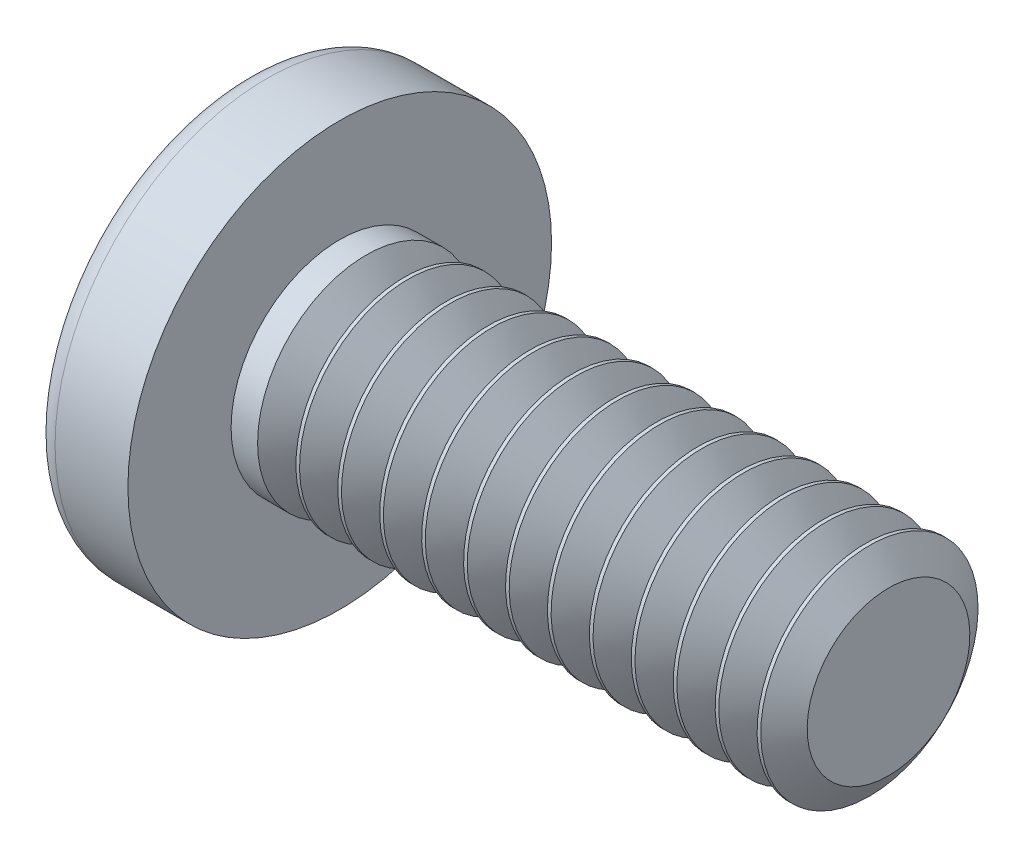
ISO-10303-21;
HEADER;
FILE_DESCRIPTION(('STEP AP214'),'2;1');
FILE_NAME('part.step','',(''),(''),'','','');
FILE_SCHEMA(('AUTOMOTIVE_DESIGN { 1 0 10303 214 1 1 1 1 }'));
ENDSEC;
DATA;
#1=APPLICATION_CONTEXT('core data for automotive mechanical design processes');
#2=APPLICATION_PROTOCOL_DEFINITION('international standard','automotive_design',2000,#1);
#3=PRODUCT_CONTEXT('',#1,'mechanical');
#4=PRODUCT('Part','Part','',(#3));
#5=PRODUCT_RELATED_PRODUCT_CATEGORY('part','',(#4));
#6=PRODUCT_DEFINITION_FORMATION('','',#4);
#7=PRODUCT_DEFINITION_CONTEXT('part definition',#1,'design');
#8=PRODUCT_DEFINITION('design','',#6,#7);
#9=PRODUCT_DEFINITION_SHAPE('','',#8);
#10=(LENGTH_UNIT() NAMED_UNIT(*) SI_UNIT(.MILLI.,.METRE.));
#11=(NAMED_UNIT(*) PLANE_ANGLE_UNIT() SI_UNIT($,.RADIAN.));
#12=(NAMED_UNIT(*) SI_UNIT($,.STERADIAN.) SOLID_ANGLE_UNIT());
#13=UNCERTAINTY_MEASURE_WITH_UNIT(LENGTH_MEASURE(1.E-05),#10,'distance_accuracy_value','');
#14=(GEOMETRIC_REPRESENTATION_CONTEXT(3) GLOBAL_UNCERTAINTY_ASSIGNED_CONTEXT((#13)) GLOBAL_UNIT_ASSIGNED_CONTEXT((#10,
#11,#12)) REPRESENTATION_CONTEXT('',''));
#15=CARTESIAN_POINT('',(0.,0.,0.));
#16=DIRECTION('',(0.,0.,1.));
#17=DIRECTION('',(1.,0.,0.));
#18=AXIS2_PLACEMENT_3D('',#15,#16,#17);
#19=CARTESIAN_POINT('',(4.02336,0.,0.));
#20=DIRECTION('',(-1.,0.,0.));
#21=DIRECTION('',(0.,1.,0.));
#22=AXIS2_PLACEMENT_3D('',#19,#20,#21);
#23=SPHERICAL_SURFACE('',#22,4.02336);
#24=CARTESIAN_POINT('',(0.754157473864415,0.,0.));
#25=DIRECTION('',(-1.,0.,0.));
#26=DIRECTION('',(0.,0.,1.));
#27=AXIS2_PLACEMENT_3D('',#24,#25,#26);
#28=CIRCLE('',#27,2.3451525606469);
#29=CARTESIAN_POINT('',(0.754157473864415,0.,2.3451525606469));
#30=VERTEX_POINT('',#29);
#31=EDGE_CURVE('E154',#30,#30,#28,.T.);
#32=ORIENTED_EDGE('',*,*,#31,.T.);
#33=EDGE_LOOP('',(#32));
#34=FACE_BOUND('',#33,.T.);
#35=CARTESIAN_POINT('',(4.01770186530247,-0.0538498336730852,0.));
#36=DIRECTION('',(-0.104497210902911,-0.994525179627702,0.));
#37=DIRECTION('',(0.994525179627702,-0.104497210902911,0.));
#38=AXIS2_PLACEMENT_3D('',#35,#36,#37);
#39=CIRCLE('',#38,4.02299563391823);
#40=CARTESIAN_POINT('',(0.259410845244607,0.341043063361975,1.37978334493095));
#41=VERTEX_POINT('',#40);
#42=CARTESIAN_POINT('',(0.0332155077767127,0.36480996476259,0.364809964762592));
#43=VERTEX_POINT('',#42);
#44=EDGE_CURVE('E185',#41,#43,#39,.T.);
#45=ORIENTED_EDGE('',*,*,#44,.F.);
#46=CARTESIAN_POINT('',(3.2260782242415,0.,-0.995700317236856));
#47=DIRECTION('',(0.625039893301157,0.,0.780592807923618));
#48=DIRECTION('',(0.780592807923618,0.,-0.625039893301158));
#49=AXIS2_PLACEMENT_3D('',#46,#47,#48);
#50=CIRCLE('',#49,3.81580245006182);
#51=CARTESIAN_POINT('',(0.259410845244607,-0.341043063361985,1.37978334493095));
#52=VERTEX_POINT('',#51);
#53=EDGE_CURVE('E153',#41,#52,#50,.T.);
#54=ORIENTED_EDGE('',*,*,#53,.T.);
#55=CARTESIAN_POINT('',(4.01770186530247,0.0538498336730849,0.));
#56=DIRECTION('',(-0.104497210902911,0.994525179627702,0.));
#57=DIRECTION('',(-0.994525179627702,-0.104497210902911,0.));
#58=AXIS2_PLACEMENT_3D('',#55,#56,#57);
#59=CIRCLE('',#58,4.02299563391823);
#60=CARTESIAN_POINT('',(0.0332155077767127,-0.364809964762593,0.364809964762591));
#61=VERTEX_POINT('',#60);
#62=EDGE_CURVE('E109',#61,#52,#59,.T.);
#63=ORIENTED_EDGE('',*,*,#62,.F.);
#64=CARTESIAN_POINT('',(4.01770186530247,0.,-0.0538498336730849));
#65=DIRECTION('',(-0.104497210902911,0.,-0.994525179627702));
#66=DIRECTION('',(-0.994525179627702,0.,0.104497210902911));
#67=AXIS2_PLACEMENT_3D('',#64,#65,#66);
#68=CIRCLE('',#67,4.02299563391823);
#69=CARTESIAN_POINT('',(0.259410845244607,-1.37978334493095,0.341043063361979));
#70=VERTEX_POINT('',#69);
#71=EDGE_CURVE('E134',#70,#61,#68,.T.);
#72=ORIENTED_EDGE('',*,*,#71,.F.);
#73=CARTESIAN_POINT('',(3.2260782242415,0.995700317236855,0.));
#74=DIRECTION('',(0.625039893301157,-0.780592807923618,0.));
#75=DIRECTION('',(0.780592807923618,0.625039893301158,0.));
#76=AXIS2_PLACEMENT_3D('',#73,#74,#75);
#77=CIRCLE('',#76,3.81580245006182);
#78=CARTESIAN_POINT('',(0.259410845244607,-1.37978334493095,-0.34104306336198));
#79=VERTEX_POINT('',#78);
#80=EDGE_CURVE('E142',#70,#79,#77,.T.);
#81=ORIENTED_EDGE('',*,*,#80,.T.);
#82=CARTESIAN_POINT('',(4.01770186530247,0.,0.0538498336730852));
#83=DIRECTION('',(-0.104497210902911,0.,0.994525179627702));
#84=DIRECTION('',(0.994525179627702,0.,0.104497210902911));
#85=AXIS2_PLACEMENT_3D('',#82,#83,#84);
#86=CIRCLE('',#85,4.02299563391823);
#87=CARTESIAN_POINT('',(0.0332155077767127,-0.36480996476259,-0.364809964762592));
#88=VERTEX_POINT('',#87);
#89=EDGE_CURVE('E52',#88,#79,#86,.T.);
#90=ORIENTED_EDGE('',*,*,#89,.F.);
#91=CARTESIAN_POINT('',(0.259410845244607,-0.341043063361975,-1.37978334493095));
#92=VERTEX_POINT('',#91);
#93=EDGE_CURVE('E192',#92,#88,#59,.T.);
#94=ORIENTED_EDGE('',*,*,#93,.F.);
#95=CARTESIAN_POINT('',(3.2260782242415,0.,0.995700317236856));
#96=DIRECTION('',(0.625039893301157,0.,-0.780592807923618));
#97=DIRECTION('',(-0.780592807923618,0.,-0.625039893301158));
#98=AXIS2_PLACEMENT_3D('',#95,#96,#97);
#99=CIRCLE('',#98,3.81580245006182);
#100=CARTESIAN_POINT('',(0.259410845244607,0.341043063361985,-1.37978334493095));
#101=VERTEX_POINT('',#100);
#102=EDGE_CURVE('E135',#92,#101,#99,.T.);
#103=ORIENTED_EDGE('',*,*,#102,.T.);
#104=CARTESIAN_POINT('',(0.0332155077767127,0.364809964762593,-0.364809964762592));
#105=VERTEX_POINT('',#104);
#106=EDGE_CURVE('E180',#105,#101,#39,.T.);
#107=ORIENTED_EDGE('',*,*,#106,.F.);
#108=CARTESIAN_POINT('',(0.259410845244607,1.37978334493095,-0.34104306336198));
#109=VERTEX_POINT('',#108);
#110=EDGE_CURVE('E45',#109,#105,#86,.T.);
#111=ORIENTED_EDGE('',*,*,#110,.F.);
#112=CARTESIAN_POINT('',(3.2260782242415,-0.995700317236856,0.));
#113=DIRECTION('',(0.625039893301157,0.780592807923618,0.));
#114=DIRECTION('',(-0.780592807923618,0.625039893301158,0.));
#115=AXIS2_PLACEMENT_3D('',#112,#113,#114);
#116=CIRCLE('',#115,3.81580245006182);
#117=CARTESIAN_POINT('',(0.259410845244607,1.37978334493095,0.34104306336198));
#118=VERTEX_POINT('',#117);
#119=EDGE_CURVE('E11',#109,#118,#116,.T.);
#120=ORIENTED_EDGE('',*,*,#119,.T.);
#121=EDGE_CURVE('E168',#43,#118,#68,.T.);
#122=ORIENTED_EDGE('',*,*,#121,.F.);
#123=EDGE_LOOP('',(#45,#54,#63,#72,#81,#90,#94,#103,#107,#111,#120,#122));
#124=FACE_BOUND('',#123,.T.);
#125=ADVANCED_FACE('F37',(#34,#124),#23,.T.);
#126=CARTESIAN_POINT('',(1.98257918552036,0.,-0.159985520361991));
#127=DIRECTION('',(-0.104497210902911,0.,0.994525179627702));
#128=DIRECTION('',(0.994525179627702,0.,0.104497210902911));
#129=AXIS2_PLACEMENT_3D('',#126,#127,#128);
#130=PLANE('',#129);
#131=ORIENTED_EDGE('',*,*,#110,.T.);
#132=DIRECTION('',(0.989139306726397,-0.103931303967629,0.103931303967629));
#133=VECTOR('',#132,1.);
#134=CARTESIAN_POINT('',(1.99902610304942,0.158257402215822,-0.158257402215822));
#135=LINE('',#134,#133);
#136=CARTESIAN_POINT('',(1.7526,0.184150000000001,-0.184149999999999));
#137=VERTEX_POINT('',#136);
#138=EDGE_CURVE('E174',#105,#137,#135,.T.);
#139=ORIENTED_EDGE('',*,*,#138,.T.);
#140=DIRECTION('',(0.777980423727664,-0.622948092912368,0.0817443198844285));
#141=VECTOR('',#140,1.);
#142=CARTESIAN_POINT('',(0.,1.5875,-0.3683));
#143=LINE('',#142,#141);
#144=EDGE_CURVE('E158',#109,#137,#143,.T.);
#145=ORIENTED_EDGE('',*,*,#144,.F.);
#146=EDGE_LOOP('',(#131,#139,#145));
#147=FACE_BOUND('',#146,.T.);
#148=ADVANCED_FACE('F173',(#147),#130,.T.);
#149=DIRECTION('',(0.777980423727664,0.622948092912368,0.0817443198844285));
#150=VECTOR('',#149,1.);
#151=CARTESIAN_POINT('',(0.,-1.5875,-0.3683));
#152=LINE('',#151,#150);
#153=CARTESIAN_POINT('',(1.7526,-0.18415,-0.18415));
#154=VERTEX_POINT('',#153);
#155=EDGE_CURVE('E143',#79,#154,#152,.T.);
#156=ORIENTED_EDGE('',*,*,#155,.T.);
#157=DIRECTION('',(-0.989139306726397,-0.103931303967628,-0.103931303967629));
#158=VECTOR('',#157,1.);
#159=CARTESIAN_POINT('',(1.99902610304942,-0.158257402215821,-0.158257402215822));
#160=LINE('',#159,#158);
#161=EDGE_CURVE('E195',#154,#88,#160,.T.);
#162=ORIENTED_EDGE('',*,*,#161,.T.);
#163=ORIENTED_EDGE('',*,*,#89,.T.);
#164=EDGE_LOOP('',(#156,#162,#163));
#165=FACE_BOUND('',#164,.T.);
#166=ADVANCED_FACE('F337',(#165),#130,.T.);
#167=CARTESIAN_POINT('',(1.98257918552036,0.,0.159985520361991));
#168=DIRECTION('',(-0.104497210902911,0.,-0.994525179627702));
#169=DIRECTION('',(-0.994525179627702,0.,0.104497210902911));
#170=AXIS2_PLACEMENT_3D('',#167,#168,#169);
#171=PLANE('',#170);
#172=DIRECTION('',(0.777980423727664,-0.622948092912368,-0.0817443198844284));
#173=VECTOR('',#172,1.);
#174=CARTESIAN_POINT('',(0.,1.5875,0.3683));
#175=LINE('',#174,#173);
#176=CARTESIAN_POINT('',(1.7526,0.18415,0.18415));
#177=VERTEX_POINT('',#176);
#178=EDGE_CURVE('E982',#118,#177,#175,.T.);
#179=ORIENTED_EDGE('',*,*,#178,.T.);
#180=DIRECTION('',(-0.989139306726397,0.103931303967628,0.103931303967629));
#181=VECTOR('',#180,1.);
#182=CARTESIAN_POINT('',(1.99902610304942,0.158257402215821,0.158257402215822));
#183=LINE('',#182,#181);
#184=EDGE_CURVE('E189',#177,#43,#183,.T.);
#185=ORIENTED_EDGE('',*,*,#184,.T.);
#186=ORIENTED_EDGE('',*,*,#121,.T.);
#187=EDGE_LOOP('',(#179,#185,#186));
#188=FACE_BOUND('',#187,.T.);
#189=ADVANCED_FACE('F367',(#188),#171,.T.);
#190=ORIENTED_EDGE('',*,*,#71,.T.);
#191=DIRECTION('',(0.989139306726397,0.103931303967629,-0.103931303967629));
#192=VECTOR('',#191,1.);
#193=CARTESIAN_POINT('',(1.99902610304942,-0.158257402215822,0.158257402215822));
#194=LINE('',#193,#192);
#195=CARTESIAN_POINT('',(1.7526,-0.184150000000001,0.18415));
#196=VERTEX_POINT('',#195);
#197=EDGE_CURVE('E107',#61,#196,#194,.T.);
#198=ORIENTED_EDGE('',*,*,#197,.T.);
#199=DIRECTION('',(0.777980423727664,0.622948092912368,-0.0817443198844283));
#200=VECTOR('',#199,1.);
#201=CARTESIAN_POINT('',(0.,-1.5875,0.3683));
#202=LINE('',#201,#200);
#203=EDGE_CURVE('E132',#70,#196,#202,.T.);
#204=ORIENTED_EDGE('',*,*,#203,.F.);
#205=EDGE_LOOP('',(#190,#198,#204));
#206=FACE_BOUND('',#205,.T.);
#207=ADVANCED_FACE('F131',(#206),#171,.T.);
#208=CARTESIAN_POINT('',(-25.4,0.,0.));
#209=DIRECTION('',(-1.,0.,0.));
#210=DIRECTION('',(0.,0.,1.));
#211=AXIS2_PLACEMENT_3D('',#208,#209,#210);
#212=CYLINDRICAL_SURFACE('',#211,1.2573);
#213=CARTESIAN_POINT('',(2.11029337019194,0.,0.));
#214=DIRECTION('',(-1.,0.,0.));
#215=DIRECTION('',(0.,-1.,0.));
#216=AXIS2_PLACEMENT_3D('',#213,#214,#215);
#217=CIRCLE('',#216,1.2573);
#218=CARTESIAN_POINT('',(2.11029337019194,-1.2573,0.));
#219=VERTEX_POINT('',#218);
#220=EDGE_CURVE('E207',#219,#219,#217,.T.);
#221=ORIENTED_EDGE('',*,*,#220,.T.);
#222=EDGE_LOOP('',(#221));
#223=FACE_BOUND('',#222,.T.);
#224=CARTESIAN_POINT('',(1.8034,0.,0.));
#225=DIRECTION('',(-1.,0.,0.));
#226=DIRECTION('',(0.,0.,1.));
#227=AXIS2_PLACEMENT_3D('',#224,#225,#226);
#228=CIRCLE('',#227,1.2573);
#229=CARTESIAN_POINT('',(1.8034,0.,1.2573));
#230=VERTEX_POINT('',#229);
#231=EDGE_CURVE('E164',#230,#230,#228,.T.);
#232=ORIENTED_EDGE('',*,*,#231,.F.);
#233=EDGE_LOOP('',(#232));
#234=FACE_BOUND('',#233,.T.);
#235=ADVANCED_FACE('F39',(#223,#234),#212,.T.);
#236=CARTESIAN_POINT('',(1.8034,1.2573,0.));
#237=DIRECTION('',(-1.,0.,0.));
#238=DIRECTION('',(0.,0.,1.));
#239=AXIS2_PLACEMENT_3D('',#236,#237,#238);
#240=PLANE('',#239);
#241=CARTESIAN_POINT('',(1.8034,0.,0.));
#242=DIRECTION('',(-1.,0.,0.));
#243=DIRECTION('',(0.,0.,1.));
#244=AXIS2_PLACEMENT_3D('',#241,#242,#243);
#245=CIRCLE('',#244,2.4511);
#246=CARTESIAN_POINT('',(1.8034,0.,2.4511));
#247=VERTEX_POINT('',#246);
#248=EDGE_CURVE('E161',#247,#247,#245,.T.);
#249=ORIENTED_EDGE('',*,*,#248,.F.);
#250=EDGE_LOOP('',(#249));
#251=FACE_BOUND('',#250,.T.);
#252=ORIENTED_EDGE('',*,*,#231,.T.);
#253=EDGE_LOOP('',(#252));
#254=FACE_BOUND('',#253,.T.);
#255=ADVANCED_FACE('F347',(#251,#254),#240,.F.);
#256=CARTESIAN_POINT('',(-25.4,0.,0.));
#257=DIRECTION('',(-1.,0.,0.));
#258=DIRECTION('',(0.,0.,1.));
#259=AXIS2_PLACEMENT_3D('',#256,#257,#258);
#260=CYLINDRICAL_SURFACE('',#259,2.4511);
#261=ORIENTED_EDGE('',*,*,#248,.T.);
#262=EDGE_LOOP('',(#261));
#263=FACE_BOUND('',#262,.T.);
#264=CARTESIAN_POINT('',(0.96054652223156,0.,0.));
#265=DIRECTION('',(-1.,0.,0.));
#266=DIRECTION('',(0.,0.,1.));
#267=AXIS2_PLACEMENT_3D('',#264,#265,#266);
#268=CIRCLE('',#267,2.4511);
#269=CARTESIAN_POINT('',(0.96054652223156,0.,2.4511));
#270=VERTEX_POINT('',#269);
#271=EDGE_CURVE('E157',#270,#270,#268,.T.);
#272=ORIENTED_EDGE('',*,*,#271,.F.);
#273=EDGE_LOOP('',(#272));
#274=FACE_BOUND('',#273,.T.);
#275=ADVANCED_FACE('F344',(#263,#274),#260,.T.);
#276=CARTESIAN_POINT('',(0.960546522231561,0.,0.));
#277=DIRECTION('',(-1.,0.,0.));
#278=DIRECTION('',(0.,0.,1.));
#279=AXIS2_PLACEMENT_3D('',#276,#277,#278);
#280=TOROIDAL_SURFACE('',#279,2.1971,0.254);
#281=ORIENTED_EDGE('',*,*,#271,.T.);
#282=EDGE_LOOP('',(#281));
#283=FACE_BOUND('',#282,.T.);
#284=ORIENTED_EDGE('',*,*,#31,.F.);
#285=EDGE_LOOP('',(#284));
#286=FACE_BOUND('',#285,.T.);
#287=ADVANCED_FACE('F340',(#283,#286),#280,.T.);
#288=CARTESIAN_POINT('',(1.7526,0.18415,0.18415));
#289=DIRECTION('',(0.625039893301157,0.780592807923618,0.));
#290=DIRECTION('',(-0.780592807923618,0.625039893301158,0.));
#291=AXIS2_PLACEMENT_3D('',#288,#289,#290);
#292=PLANE('',#291);
#293=ORIENTED_EDGE('',*,*,#144,.T.);
#294=DIRECTION('',(0.,0.,-1.));
#295=VECTOR('',#294,1.);
#296=CARTESIAN_POINT('',(1.7526,0.18415,0.18415));
#297=LINE('',#296,#295);
#298=EDGE_CURVE('E125',#177,#137,#297,.T.);
#299=ORIENTED_EDGE('',*,*,#298,.F.);
#300=ORIENTED_EDGE('',*,*,#178,.F.);
#301=ORIENTED_EDGE('',*,*,#119,.F.);
#302=EDGE_LOOP('',(#293,#299,#300,#301));
#303=FACE_BOUND('',#302,.T.);
#304=ADVANCED_FACE('F343',(#303),#292,.F.);
#305=CARTESIAN_POINT('',(1.7526,-0.18415,-0.18415));
#306=DIRECTION('',(0.625039893301157,-0.780592807923618,0.));
#307=DIRECTION('',(0.780592807923618,0.625039893301158,0.));
#308=AXIS2_PLACEMENT_3D('',#305,#306,#307);
#309=PLANE('',#308);
#310=ORIENTED_EDGE('',*,*,#203,.T.);
#311=DIRECTION('',(0.,0.,1.));
#312=VECTOR('',#311,1.);
#313=CARTESIAN_POINT('',(1.7526,-0.18415,-0.18415));
#314=LINE('',#313,#312);
#315=EDGE_CURVE('E124',#154,#196,#314,.T.);
#316=ORIENTED_EDGE('',*,*,#315,.F.);
#317=ORIENTED_EDGE('',*,*,#155,.F.);
#318=ORIENTED_EDGE('',*,*,#80,.F.);
#319=EDGE_LOOP('',(#310,#316,#317,#318));
#320=FACE_BOUND('',#319,.T.);
#321=ADVANCED_FACE('F139',(#320),#309,.F.);
#322=CARTESIAN_POINT('',(1.7526,0.18415,-0.18415));
#323=DIRECTION('',(-1.,0.,0.));
#324=DIRECTION('',(0.,0.,1.));
#325=AXIS2_PLACEMENT_3D('',#322,#323,#324);
#326=PLANE('',#325);
#327=DIRECTION('',(0.,1.,0.));
#328=VECTOR('',#327,1.);
#329=CARTESIAN_POINT('',(1.7526,-0.18415,-0.18415));
#330=LINE('',#329,#328);
#331=EDGE_CURVE('E147',#154,#137,#330,.T.);
#332=ORIENTED_EDGE('',*,*,#331,.F.);
#333=ORIENTED_EDGE('',*,*,#315,.T.);
#334=DIRECTION('',(0.,-1.,0.));
#335=VECTOR('',#334,1.);
#336=CARTESIAN_POINT('',(1.7526,0.18415,0.18415));
#337=LINE('',#336,#335);
#338=EDGE_CURVE('E116',#177,#196,#337,.T.);
#339=ORIENTED_EDGE('',*,*,#338,.F.);
#340=ORIENTED_EDGE('',*,*,#298,.T.);
#341=EDGE_LOOP('',(#332,#333,#339,#340));
#342=FACE_BOUND('',#341,.T.);
#343=ADVANCED_FACE('F145',(#342),#326,.T.);
#344=CARTESIAN_POINT('',(1.7526,0.184150000000001,-0.184149999999999));
#345=DIRECTION('',(0.625039893301157,0.,-0.780592807923618));
#346=DIRECTION('',(0.780592807923618,0.,0.625039893301158));
#347=AXIS2_PLACEMENT_3D('',#344,#345,#346);
#348=PLANE('',#347);
#349=DIRECTION('',(0.777980423727664,0.0817443198844261,0.622948092912369));
#350=VECTOR('',#349,1.);
#351=CARTESIAN_POINT('',(0.,-0.368299999999994,-1.5875));
#352=LINE('',#351,#350);
#353=EDGE_CURVE('E200',#92,#154,#352,.T.);
#354=ORIENTED_EDGE('',*,*,#353,.T.);
#355=ORIENTED_EDGE('',*,*,#331,.T.);
#356=DIRECTION('',(0.777980423727664,-0.0817443198844306,0.622948092912368));
#357=VECTOR('',#356,1.);
#358=CARTESIAN_POINT('',(0.,0.368300000000006,-1.5875));
#359=LINE('',#358,#357);
#360=EDGE_CURVE('E113',#101,#137,#359,.T.);
#361=ORIENTED_EDGE('',*,*,#360,.F.);
#362=ORIENTED_EDGE('',*,*,#102,.F.);
#363=EDGE_LOOP('',(#354,#355,#361,#362));
#364=FACE_BOUND('',#363,.T.);
#365=ADVANCED_FACE('F552',(#364),#348,.F.);
#366=CARTESIAN_POINT('',(1.98257918552036,-0.159985520361991,0.));
#367=DIRECTION('',(-0.104497210902911,0.994525179627702,0.));
#368=DIRECTION('',(-0.994525179627702,-0.104497210902911,0.));
#369=AXIS2_PLACEMENT_3D('',#366,#367,#368);
#370=PLANE('',#369);
#371=ORIENTED_EDGE('',*,*,#93,.T.);
#372=ORIENTED_EDGE('',*,*,#161,.F.);
#373=ORIENTED_EDGE('',*,*,#353,.F.);
#374=EDGE_LOOP('',(#371,#372,#373));
#375=FACE_BOUND('',#374,.T.);
#376=ADVANCED_FACE('F549',(#375),#370,.T.);
#377=CARTESIAN_POINT('',(1.98257918552036,0.159985520361991,0.));
#378=DIRECTION('',(-0.104497210902911,-0.994525179627702,0.));
#379=DIRECTION('',(0.994525179627702,-0.104497210902911,0.));
#380=AXIS2_PLACEMENT_3D('',#377,#378,#379);
#381=PLANE('',#380);
#382=ORIENTED_EDGE('',*,*,#106,.T.);
#383=ORIENTED_EDGE('',*,*,#360,.T.);
#384=ORIENTED_EDGE('',*,*,#138,.F.);
#385=EDGE_LOOP('',(#382,#383,#384));
#386=FACE_BOUND('',#385,.T.);
#387=ADVANCED_FACE('F546',(#386),#381,.T.);
#388=CARTESIAN_POINT('',(1.7526,-0.184150000000001,0.184149999999999));
#389=DIRECTION('',(0.625039893301157,0.,0.780592807923618));
#390=DIRECTION('',(-0.780592807923618,0.,0.625039893301158));
#391=AXIS2_PLACEMENT_3D('',#388,#389,#390);
#392=PLANE('',#391);
#393=DIRECTION('',(0.777980423727664,-0.0817443198844263,-0.622948092912369));
#394=VECTOR('',#393,1.);
#395=CARTESIAN_POINT('',(0.,0.368299999999994,1.5875));
#396=LINE('',#395,#394);
#397=EDGE_CURVE('E112',#41,#177,#396,.T.);
#398=ORIENTED_EDGE('',*,*,#397,.T.);
#399=ORIENTED_EDGE('',*,*,#338,.T.);
#400=DIRECTION('',(0.777980423727664,0.0817443198844306,-0.622948092912368));
#401=VECTOR('',#400,1.);
#402=CARTESIAN_POINT('',(0.,-0.368300000000005,1.5875));
#403=LINE('',#402,#401);
#404=EDGE_CURVE('E103',#52,#196,#403,.T.);
#405=ORIENTED_EDGE('',*,*,#404,.F.);
#406=ORIENTED_EDGE('',*,*,#53,.F.);
#407=EDGE_LOOP('',(#398,#399,#405,#406));
#408=FACE_BOUND('',#407,.T.);
#409=ADVANCED_FACE('F117',(#408),#392,.F.);
#410=ORIENTED_EDGE('',*,*,#44,.T.);
#411=ORIENTED_EDGE('',*,*,#184,.F.);
#412=ORIENTED_EDGE('',*,*,#397,.F.);
#413=EDGE_LOOP('',(#410,#411,#412));
#414=FACE_BOUND('',#413,.T.);
#415=ADVANCED_FACE('F545',(#414),#381,.T.);
#416=ORIENTED_EDGE('',*,*,#62,.T.);
#417=ORIENTED_EDGE('',*,*,#404,.T.);
#418=ORIENTED_EDGE('',*,*,#197,.F.);
#419=EDGE_LOOP('',(#416,#417,#418));
#420=FACE_BOUND('',#419,.T.);
#421=ADVANCED_FACE('F105',(#420),#370,.T.);
#422=CARTESIAN_POINT('',(2.55314662980806,0.,0.));
#423=DIRECTION('',(1.,0.,0.));
#424=DIRECTION('',(0.,1.,0.));
#425=AXIS2_PLACEMENT_3D('',#422,#423,#424);
#426=CONICAL_SURFACE('',#425,1.2573,0.959931088596883);
#427=CARTESIAN_POINT('',(2.33172,0.,0.));
#428=DIRECTION('',(-1.,0.,0.));
#429=DIRECTION('',(0.,-1.,0.));
#430=AXIS2_PLACEMENT_3D('',#427,#428,#429);
#431=CIRCLE('',#430,0.941070000000001);
#432=CARTESIAN_POINT('',(2.33172,-0.94107,0.));
#433=VERTEX_POINT('',#432);
#434=EDGE_CURVE('E210',#433,#433,#431,.T.);
#435=ORIENTED_EDGE('',*,*,#434,.F.);
#436=EDGE_LOOP('',(#435));
#437=FACE_BOUND('',#436,.T.);
#438=CARTESIAN_POINT('',(2.55314662980806,0.,0.));
#439=DIRECTION('',(-1.,0.,0.));
#440=DIRECTION('',(0.,-1.,0.));
#441=AXIS2_PLACEMENT_3D('',#438,#439,#440);
#442=CIRCLE('',#441,1.2573);
#443=CARTESIAN_POINT('',(2.55314662980806,-1.2573,0.));
#444=VERTEX_POINT('',#443);
#445=EDGE_CURVE('E202',#444,#444,#442,.T.);
#446=ORIENTED_EDGE('',*,*,#445,.T.);
#447=EDGE_LOOP('',(#446));
#448=FACE_BOUND('',#447,.T.);
#449=ADVANCED_FACE('F385',(#437,#448),#426,.T.);
#450=CARTESIAN_POINT('',(2.33172,0.,0.));
#451=DIRECTION('',(-1.,0.,0.));
#452=DIRECTION('',(0.,-1.,0.));
#453=AXIS2_PLACEMENT_3D('',#450,#451,#452);
#454=CONICAL_SURFACE('',#453,0.941070000000001,0.959931088596875);
#455=ORIENTED_EDGE('',*,*,#220,.F.);
#456=EDGE_LOOP('',(#455));
#457=FACE_BOUND('',#456,.T.);
#458=ORIENTED_EDGE('',*,*,#434,.T.);
#459=EDGE_LOOP('',(#458));
#460=FACE_BOUND('',#459,.T.);
#461=ADVANCED_FACE('F375',(#457,#460),#454,.T.);
#462=CARTESIAN_POINT('',(2.59543337019194,0.,0.));
#463=DIRECTION('',(-1.,0.,0.));
#464=DIRECTION('',(0.,-1.,0.));
#465=AXIS2_PLACEMENT_3D('',#462,#463,#464);
#466=CIRCLE('',#465,1.2573);
#467=CARTESIAN_POINT('',(2.59543337019194,-1.2573,0.));
#468=VERTEX_POINT('',#467);
#469=EDGE_CURVE('E216',#468,#468,#466,.T.);
#470=ORIENTED_EDGE('',*,*,#469,.T.);
#471=EDGE_LOOP('',(#470));
#472=FACE_BOUND('',#471,.T.);
#473=ORIENTED_EDGE('',*,*,#445,.F.);
#474=EDGE_LOOP('',(#473));
#475=FACE_BOUND('',#474,.T.);
#476=ADVANCED_FACE('F355',(#472,#475),#212,.T.);
#477=CARTESIAN_POINT('',(3.03828662980806,0.,0.));
#478=DIRECTION('',(1.,0.,0.));
#479=DIRECTION('',(0.,1.,0.));
#480=AXIS2_PLACEMENT_3D('',#477,#478,#479);
#481=CONICAL_SURFACE('',#480,1.2573,0.959931088596883);
#482=CARTESIAN_POINT('',(2.81686,0.,0.));
#483=DIRECTION('',(-1.,0.,0.));
#484=DIRECTION('',(0.,-1.,0.));
#485=AXIS2_PLACEMENT_3D('',#482,#483,#484);
#486=CIRCLE('',#485,0.941070000000001);
#487=CARTESIAN_POINT('',(2.81686,-0.94107,0.));
#488=VERTEX_POINT('',#487);
#489=EDGE_CURVE('E219',#488,#488,#486,.T.);
#490=ORIENTED_EDGE('',*,*,#489,.F.);
#491=EDGE_LOOP('',(#490));
#492=FACE_BOUND('',#491,.T.);
#493=CARTESIAN_POINT('',(3.03828662980806,0.,0.));
#494=DIRECTION('',(-1.,0.,0.));
#495=DIRECTION('',(0.,-1.,0.));
#496=AXIS2_PLACEMENT_3D('',#493,#494,#495);
#497=CIRCLE('',#496,1.2573);
#498=CARTESIAN_POINT('',(3.03828662980806,-1.2573,0.));
#499=VERTEX_POINT('',#498);
#500=EDGE_CURVE('E213',#499,#499,#497,.T.);
#501=ORIENTED_EDGE('',*,*,#500,.T.);
#502=EDGE_LOOP('',(#501));
#503=FACE_BOUND('',#502,.T.);
#504=ADVANCED_FACE('F374',(#492,#503),#481,.T.);
#505=CARTESIAN_POINT('',(2.81686,0.,0.));
#506=DIRECTION('',(-1.,0.,0.));
#507=DIRECTION('',(0.,-1.,0.));
#508=AXIS2_PLACEMENT_3D('',#505,#506,#507);
#509=CONICAL_SURFACE('',#508,0.941070000000001,0.959931088596875);
#510=ORIENTED_EDGE('',*,*,#469,.F.);
#511=EDGE_LOOP('',(#510));
#512=FACE_BOUND('',#511,.T.);
#513=ORIENTED_EDGE('',*,*,#489,.T.);
#514=EDGE_LOOP('',(#513));
#515=FACE_BOUND('',#514,.T.);
#516=ADVANCED_FACE('F382',(#512,#515),#509,.T.);
#517=CARTESIAN_POINT('',(3.08057337019194,0.,0.));
#518=DIRECTION('',(-1.,0.,0.));
#519=DIRECTION('',(0.,-1.,0.));
#520=AXIS2_PLACEMENT_3D('',#517,#518,#519);
#521=CIRCLE('',#520,1.2573);
#522=CARTESIAN_POINT('',(3.08057337019194,-1.2573,0.));
#523=VERTEX_POINT('',#522);
#524=EDGE_CURVE('E225',#523,#523,#521,.T.);
#525=ORIENTED_EDGE('',*,*,#524,.T.);
#526=EDGE_LOOP('',(#525));
#527=FACE_BOUND('',#526,.T.);
#528=ORIENTED_EDGE('',*,*,#500,.F.);
#529=EDGE_LOOP('',(#528));
#530=FACE_BOUND('',#529,.T.);
#531=ADVANCED_FACE('F377',(#527,#530),#212,.T.);
#532=CARTESIAN_POINT('',(3.52342662980806,0.,0.));
#533=DIRECTION('',(1.,0.,0.));
#534=DIRECTION('',(0.,1.,0.));
#535=AXIS2_PLACEMENT_3D('',#532,#533,#534);
#536=CONICAL_SURFACE('',#535,1.2573,0.959931088596883);
#537=CARTESIAN_POINT('',(3.302,0.,0.));
#538=DIRECTION('',(-1.,0.,0.));
#539=DIRECTION('',(0.,-1.,0.));
#540=AXIS2_PLACEMENT_3D('',#537,#538,#539);
#541=CIRCLE('',#540,0.941070000000001);
#542=CARTESIAN_POINT('',(3.302,-0.94107,0.));
#543=VERTEX_POINT('',#542);
#544=EDGE_CURVE('E228',#543,#543,#541,.T.);
#545=ORIENTED_EDGE('',*,*,#544,.F.);
#546=EDGE_LOOP('',(#545));
#547=FACE_BOUND('',#546,.T.);
#548=CARTESIAN_POINT('',(3.52342662980806,0.,0.));
#549=DIRECTION('',(-1.,0.,0.));
#550=DIRECTION('',(0.,-1.,0.));
#551=AXIS2_PLACEMENT_3D('',#548,#549,#550);
#552=CIRCLE('',#551,1.2573);
#553=CARTESIAN_POINT('',(3.52342662980806,-1.2573,0.));
#554=VERTEX_POINT('',#553);
#555=EDGE_CURVE('E222',#554,#554,#552,.T.);
#556=ORIENTED_EDGE('',*,*,#555,.T.);
#557=EDGE_LOOP('',(#556));
#558=FACE_BOUND('',#557,.T.);
#559=ADVANCED_FACE('F390',(#547,#558),#536,.T.);
#560=CARTESIAN_POINT('',(3.302,0.,0.));
#561=DIRECTION('',(-1.,0.,0.));
#562=DIRECTION('',(0.,-1.,0.));
#563=AXIS2_PLACEMENT_3D('',#560,#561,#562);
#564=CONICAL_SURFACE('',#563,0.941070000000001,0.959931088596875);
#565=ORIENTED_EDGE('',*,*,#524,.F.);
#566=EDGE_LOOP('',(#565));
#567=FACE_BOUND('',#566,.T.);
#568=ORIENTED_EDGE('',*,*,#544,.T.);
#569=EDGE_LOOP('',(#568));
#570=FACE_BOUND('',#569,.T.);
#571=ADVANCED_FACE('F397',(#567,#570),#564,.T.);
#572=CARTESIAN_POINT('',(3.56571337019194,0.,0.));
#573=DIRECTION('',(-1.,0.,0.));
#574=DIRECTION('',(0.,-1.,0.));
#575=AXIS2_PLACEMENT_3D('',#572,#573,#574);
#576=CIRCLE('',#575,1.2573);
#577=CARTESIAN_POINT('',(3.56571337019194,-1.2573,0.));
#578=VERTEX_POINT('',#577);
#579=EDGE_CURVE('E234',#578,#578,#576,.T.);
#580=ORIENTED_EDGE('',*,*,#579,.T.);
#581=EDGE_LOOP('',(#580));
#582=FACE_BOUND('',#581,.T.);
#583=ORIENTED_EDGE('',*,*,#555,.F.);
#584=EDGE_LOOP('',(#583));
#585=FACE_BOUND('',#584,.T.);
#586=ADVANCED_FACE('F392',(#582,#585),#212,.T.);
#587=CARTESIAN_POINT('',(4.00856662980806,0.,0.));
#588=DIRECTION('',(1.,0.,0.));
#589=DIRECTION('',(0.,1.,0.));
#590=AXIS2_PLACEMENT_3D('',#587,#588,#589);
#591=CONICAL_SURFACE('',#590,1.2573,0.959931088596883);
#592=CARTESIAN_POINT('',(3.78714,0.,0.));
#593=DIRECTION('',(-1.,0.,0.));
#594=DIRECTION('',(0.,-1.,0.));
#595=AXIS2_PLACEMENT_3D('',#592,#593,#594);
#596=CIRCLE('',#595,0.941070000000001);
#597=CARTESIAN_POINT('',(3.78714,-0.94107,0.));
#598=VERTEX_POINT('',#597);
#599=EDGE_CURVE('E237',#598,#598,#596,.T.);
#600=ORIENTED_EDGE('',*,*,#599,.F.);
#601=EDGE_LOOP('',(#600));
#602=FACE_BOUND('',#601,.T.);
#603=CARTESIAN_POINT('',(4.00856662980806,0.,0.));
#604=DIRECTION('',(-1.,0.,0.));
#605=DIRECTION('',(0.,-1.,0.));
#606=AXIS2_PLACEMENT_3D('',#603,#604,#605);
#607=CIRCLE('',#606,1.2573);
#608=CARTESIAN_POINT('',(4.00856662980806,-1.2573,0.));
#609=VERTEX_POINT('',#608);
#610=EDGE_CURVE('E231',#609,#609,#607,.T.);
#611=ORIENTED_EDGE('',*,*,#610,.T.);
#612=EDGE_LOOP('',(#611));
#613=FACE_BOUND('',#612,.T.);
#614=ADVANCED_FACE('F404',(#602,#613),#591,.T.);
#615=CARTESIAN_POINT('',(3.78714,0.,0.));
#616=DIRECTION('',(-1.,0.,0.));
#617=DIRECTION('',(0.,-1.,0.));
#618=AXIS2_PLACEMENT_3D('',#615,#616,#617);
#619=CONICAL_SURFACE('',#618,0.941070000000001,0.959931088596875);
#620=ORIENTED_EDGE('',*,*,#579,.F.);
#621=EDGE_LOOP('',(#620));
#622=FACE_BOUND('',#621,.T.);
#623=ORIENTED_EDGE('',*,*,#599,.T.);
#624=EDGE_LOOP('',(#623));
#625=FACE_BOUND('',#624,.T.);
#626=ADVANCED_FACE('F411',(#622,#625),#619,.T.);
#627=CARTESIAN_POINT('',(4.05085337019194,0.,0.));
#628=DIRECTION('',(-1.,0.,0.));
#629=DIRECTION('',(0.,-1.,0.));
#630=AXIS2_PLACEMENT_3D('',#627,#628,#629);
#631=CIRCLE('',#630,1.2573);
#632=CARTESIAN_POINT('',(4.05085337019194,-1.2573,0.));
#633=VERTEX_POINT('',#632);
#634=EDGE_CURVE('E243',#633,#633,#631,.T.);
#635=ORIENTED_EDGE('',*,*,#634,.T.);
#636=EDGE_LOOP('',(#635));
#637=FACE_BOUND('',#636,.T.);
#638=ORIENTED_EDGE('',*,*,#610,.F.);
#639=EDGE_LOOP('',(#638));
#640=FACE_BOUND('',#639,.T.);
#641=ADVANCED_FACE('F406',(#637,#640),#212,.T.);
#642=CARTESIAN_POINT('',(4.49370662980806,0.,0.));
#643=DIRECTION('',(1.,0.,0.));
#644=DIRECTION('',(0.,1.,0.));
#645=AXIS2_PLACEMENT_3D('',#642,#643,#644);
#646=CONICAL_SURFACE('',#645,1.2573,0.959931088596883);
#647=CARTESIAN_POINT('',(4.27228,0.,0.));
#648=DIRECTION('',(-1.,0.,0.));
#649=DIRECTION('',(0.,-1.,0.));
#650=AXIS2_PLACEMENT_3D('',#647,#648,#649);
#651=CIRCLE('',#650,0.941070000000001);
#652=CARTESIAN_POINT('',(4.27228,-0.94107,0.));
#653=VERTEX_POINT('',#652);
#654=EDGE_CURVE('E246',#653,#653,#651,.T.);
#655=ORIENTED_EDGE('',*,*,#654,.F.);
#656=EDGE_LOOP('',(#655));
#657=FACE_BOUND('',#656,.T.);
#658=CARTESIAN_POINT('',(4.49370662980806,0.,0.));
#659=DIRECTION('',(-1.,0.,0.));
#660=DIRECTION('',(0.,-1.,0.));
#661=AXIS2_PLACEMENT_3D('',#658,#659,#660);
#662=CIRCLE('',#661,1.2573);
#663=CARTESIAN_POINT('',(4.49370662980806,-1.2573,0.));
#664=VERTEX_POINT('',#663);
#665=EDGE_CURVE('E240',#664,#664,#662,.T.);
#666=ORIENTED_EDGE('',*,*,#665,.T.);
#667=EDGE_LOOP('',(#666));
#668=FACE_BOUND('',#667,.T.);
#669=ADVANCED_FACE('F418',(#657,#668),#646,.T.);
#670=CARTESIAN_POINT('',(4.27228,0.,0.));
#671=DIRECTION('',(-1.,0.,0.));
#672=DIRECTION('',(0.,-1.,0.));
#673=AXIS2_PLACEMENT_3D('',#670,#671,#672);
#674=CONICAL_SURFACE('',#673,0.941070000000001,0.959931088596875);
#675=ORIENTED_EDGE('',*,*,#634,.F.);
#676=EDGE_LOOP('',(#675));
#677=FACE_BOUND('',#676,.T.);
#678=ORIENTED_EDGE('',*,*,#654,.T.);
#679=EDGE_LOOP('',(#678));
#680=FACE_BOUND('',#679,.T.);
#681=ADVANCED_FACE('F425',(#677,#680),#674,.T.);
#682=CARTESIAN_POINT('',(4.53599337019194,0.,0.));
#683=DIRECTION('',(-1.,0.,0.));
#684=DIRECTION('',(0.,-1.,0.));
#685=AXIS2_PLACEMENT_3D('',#682,#683,#684);
#686=CIRCLE('',#685,1.2573);
#687=CARTESIAN_POINT('',(4.53599337019194,-1.2573,0.));
#688=VERTEX_POINT('',#687);
#689=EDGE_CURVE('E252',#688,#688,#686,.T.);
#690=ORIENTED_EDGE('',*,*,#689,.T.);
#691=EDGE_LOOP('',(#690));
#692=FACE_BOUND('',#691,.T.);
#693=ORIENTED_EDGE('',*,*,#665,.F.);
#694=EDGE_LOOP('',(#693));
#695=FACE_BOUND('',#694,.T.);
#696=ADVANCED_FACE('F420',(#692,#695),#212,.T.);
#697=CARTESIAN_POINT('',(4.97884662980806,0.,0.));
#698=DIRECTION('',(1.,0.,0.));
#699=DIRECTION('',(0.,1.,0.));
#700=AXIS2_PLACEMENT_3D('',#697,#698,#699);
#701=CONICAL_SURFACE('',#700,1.2573,0.959931088596883);
#702=CARTESIAN_POINT('',(4.75742,0.,0.));
#703=DIRECTION('',(-1.,0.,0.));
#704=DIRECTION('',(0.,-1.,0.));
#705=AXIS2_PLACEMENT_3D('',#702,#703,#704);
#706=CIRCLE('',#705,0.941070000000001);
#707=CARTESIAN_POINT('',(4.75742,-0.94107,0.));
#708=VERTEX_POINT('',#707);
#709=EDGE_CURVE('E255',#708,#708,#706,.T.);
#710=ORIENTED_EDGE('',*,*,#709,.F.);
#711=EDGE_LOOP('',(#710));
#712=FACE_BOUND('',#711,.T.);
#713=CARTESIAN_POINT('',(4.97884662980806,0.,0.));
#714=DIRECTION('',(-1.,0.,0.));
#715=DIRECTION('',(0.,-1.,0.));
#716=AXIS2_PLACEMENT_3D('',#713,#714,#715);
#717=CIRCLE('',#716,1.2573);
#718=CARTESIAN_POINT('',(4.97884662980806,-1.2573,0.));
#719=VERTEX_POINT('',#718);
#720=EDGE_CURVE('E249',#719,#719,#717,.T.);
#721=ORIENTED_EDGE('',*,*,#720,.T.);
#722=EDGE_LOOP('',(#721));
#723=FACE_BOUND('',#722,.T.);
#724=ADVANCED_FACE('F432',(#712,#723),#701,.T.);
#725=CARTESIAN_POINT('',(4.75742,0.,0.));
#726=DIRECTION('',(-1.,0.,0.));
#727=DIRECTION('',(0.,-1.,0.));
#728=AXIS2_PLACEMENT_3D('',#725,#726,#727);
#729=CONICAL_SURFACE('',#728,0.941070000000001,0.959931088596875);
#730=ORIENTED_EDGE('',*,*,#689,.F.);
#731=EDGE_LOOP('',(#730));
#732=FACE_BOUND('',#731,.T.);
#733=ORIENTED_EDGE('',*,*,#709,.T.);
#734=EDGE_LOOP('',(#733));
#735=FACE_BOUND('',#734,.T.);
#736=ADVANCED_FACE('F439',(#732,#735),#729,.T.);
#737=CARTESIAN_POINT('',(5.02113337019194,0.,0.));
#738=DIRECTION('',(-1.,0.,0.));
#739=DIRECTION('',(0.,-1.,0.));
#740=AXIS2_PLACEMENT_3D('',#737,#738,#739);
#741=CIRCLE('',#740,1.2573);
#742=CARTESIAN_POINT('',(5.02113337019194,-1.2573,0.));
#743=VERTEX_POINT('',#742);
#744=EDGE_CURVE('E261',#743,#743,#741,.T.);
#745=ORIENTED_EDGE('',*,*,#744,.T.);
#746=EDGE_LOOP('',(#745));
#747=FACE_BOUND('',#746,.T.);
#748=ORIENTED_EDGE('',*,*,#720,.F.);
#749=EDGE_LOOP('',(#748));
#750=FACE_BOUND('',#749,.T.);
#751=ADVANCED_FACE('F434',(#747,#750),#212,.T.);
#752=CARTESIAN_POINT('',(5.46398662980805,0.,0.));
#753=DIRECTION('',(1.,0.,0.));
#754=DIRECTION('',(0.,1.,0.));
#755=AXIS2_PLACEMENT_3D('',#752,#753,#754);
#756=CONICAL_SURFACE('',#755,1.2573,0.959931088596883);
#757=CARTESIAN_POINT('',(5.24256,0.,0.));
#758=DIRECTION('',(-1.,0.,0.));
#759=DIRECTION('',(0.,-1.,0.));
#760=AXIS2_PLACEMENT_3D('',#757,#758,#759);
#761=CIRCLE('',#760,0.941070000000001);
#762=CARTESIAN_POINT('',(5.24256,-0.94107,0.));
#763=VERTEX_POINT('',#762);
#764=EDGE_CURVE('E264',#763,#763,#761,.T.);
#765=ORIENTED_EDGE('',*,*,#764,.F.);
#766=EDGE_LOOP('',(#765));
#767=FACE_BOUND('',#766,.T.);
#768=CARTESIAN_POINT('',(5.46398662980805,0.,0.));
#769=DIRECTION('',(-1.,0.,0.));
#770=DIRECTION('',(0.,-1.,0.));
#771=AXIS2_PLACEMENT_3D('',#768,#769,#770);
#772=CIRCLE('',#771,1.2573);
#773=CARTESIAN_POINT('',(5.46398662980805,-1.2573,0.));
#774=VERTEX_POINT('',#773);
#775=EDGE_CURVE('E258',#774,#774,#772,.T.);
#776=ORIENTED_EDGE('',*,*,#775,.T.);
#777=EDGE_LOOP('',(#776));
#778=FACE_BOUND('',#777,.T.);
#779=ADVANCED_FACE('F446',(#767,#778),#756,.T.);
#780=CARTESIAN_POINT('',(5.24256,0.,0.));
#781=DIRECTION('',(-1.,0.,0.));
#782=DIRECTION('',(0.,-1.,0.));
#783=AXIS2_PLACEMENT_3D('',#780,#781,#782);
#784=CONICAL_SURFACE('',#783,0.941070000000001,0.959931088596875);
#785=ORIENTED_EDGE('',*,*,#744,.F.);
#786=EDGE_LOOP('',(#785));
#787=FACE_BOUND('',#786,.T.);
#788=ORIENTED_EDGE('',*,*,#764,.T.);
#789=EDGE_LOOP('',(#788));
#790=FACE_BOUND('',#789,.T.);
#791=ADVANCED_FACE('F453',(#787,#790),#784,.T.);
#792=CARTESIAN_POINT('',(5.50627337019194,0.,0.));
#793=DIRECTION('',(-1.,0.,0.));
#794=DIRECTION('',(0.,-1.,0.));
#795=AXIS2_PLACEMENT_3D('',#792,#793,#794);
#796=CIRCLE('',#795,1.2573);
#797=CARTESIAN_POINT('',(5.50627337019194,-1.2573,0.));
#798=VERTEX_POINT('',#797);
#799=EDGE_CURVE('E270',#798,#798,#796,.T.);
#800=ORIENTED_EDGE('',*,*,#799,.T.);
#801=EDGE_LOOP('',(#800));
#802=FACE_BOUND('',#801,.T.);
#803=ORIENTED_EDGE('',*,*,#775,.F.);
#804=EDGE_LOOP('',(#803));
#805=FACE_BOUND('',#804,.T.);
#806=ADVANCED_FACE('F448',(#802,#805),#212,.T.);
#807=CARTESIAN_POINT('',(5.94912662980806,0.,0.));
#808=DIRECTION('',(1.,0.,0.));
#809=DIRECTION('',(0.,1.,0.));
#810=AXIS2_PLACEMENT_3D('',#807,#808,#809);
#811=CONICAL_SURFACE('',#810,1.2573,0.959931088596883);
#812=CARTESIAN_POINT('',(5.7277,0.,0.));
#813=DIRECTION('',(-1.,0.,0.));
#814=DIRECTION('',(0.,-1.,0.));
#815=AXIS2_PLACEMENT_3D('',#812,#813,#814);
#816=CIRCLE('',#815,0.941070000000001);
#817=CARTESIAN_POINT('',(5.7277,-0.94107,0.));
#818=VERTEX_POINT('',#817);
#819=EDGE_CURVE('E273',#818,#818,#816,.T.);
#820=ORIENTED_EDGE('',*,*,#819,.F.);
#821=EDGE_LOOP('',(#820));
#822=FACE_BOUND('',#821,.T.);
#823=CARTESIAN_POINT('',(5.94912662980806,0.,0.));
#824=DIRECTION('',(-1.,0.,0.));
#825=DIRECTION('',(0.,-1.,0.));
#826=AXIS2_PLACEMENT_3D('',#823,#824,#825);
#827=CIRCLE('',#826,1.2573);
#828=CARTESIAN_POINT('',(5.94912662980806,-1.2573,0.));
#829=VERTEX_POINT('',#828);
#830=EDGE_CURVE('E267',#829,#829,#827,.T.);
#831=ORIENTED_EDGE('',*,*,#830,.T.);
#832=EDGE_LOOP('',(#831));
#833=FACE_BOUND('',#832,.T.);
#834=ADVANCED_FACE('F460',(#822,#833),#811,.T.);
#835=CARTESIAN_POINT('',(5.7277,0.,0.));
#836=DIRECTION('',(-1.,0.,0.));
#837=DIRECTION('',(0.,-1.,0.));
#838=AXIS2_PLACEMENT_3D('',#835,#836,#837);
#839=CONICAL_SURFACE('',#838,0.941070000000001,0.959931088596875);
#840=ORIENTED_EDGE('',*,*,#799,.F.);
#841=EDGE_LOOP('',(#840));
#842=FACE_BOUND('',#841,.T.);
#843=ORIENTED_EDGE('',*,*,#819,.T.);
#844=EDGE_LOOP('',(#843));
#845=FACE_BOUND('',#844,.T.);
#846=ADVANCED_FACE('F467',(#842,#845),#839,.T.);
#847=CARTESIAN_POINT('',(5.99141337019194,0.,0.));
#848=DIRECTION('',(-1.,0.,0.));
#849=DIRECTION('',(0.,-1.,0.));
#850=AXIS2_PLACEMENT_3D('',#847,#848,#849);
#851=CIRCLE('',#850,1.2573);
#852=CARTESIAN_POINT('',(5.99141337019194,-1.2573,0.));
#853=VERTEX_POINT('',#852);
#854=EDGE_CURVE('E279',#853,#853,#851,.T.);
#855=ORIENTED_EDGE('',*,*,#854,.T.);
#856=EDGE_LOOP('',(#855));
#857=FACE_BOUND('',#856,.T.);
#858=ORIENTED_EDGE('',*,*,#830,.F.);
#859=EDGE_LOOP('',(#858));
#860=FACE_BOUND('',#859,.T.);
#861=ADVANCED_FACE('F462',(#857,#860),#212,.T.);
#862=CARTESIAN_POINT('',(6.43426662980806,0.,0.));
#863=DIRECTION('',(1.,0.,0.));
#864=DIRECTION('',(0.,1.,0.));
#865=AXIS2_PLACEMENT_3D('',#862,#863,#864);
#866=CONICAL_SURFACE('',#865,1.2573,0.959931088596883);
#867=CARTESIAN_POINT('',(6.21284,0.,0.));
#868=DIRECTION('',(-1.,0.,0.));
#869=DIRECTION('',(0.,-1.,0.));
#870=AXIS2_PLACEMENT_3D('',#867,#868,#869);
#871=CIRCLE('',#870,0.941070000000001);
#872=CARTESIAN_POINT('',(6.21284,-0.94107,0.));
#873=VERTEX_POINT('',#872);
#874=EDGE_CURVE('E282',#873,#873,#871,.T.);
#875=ORIENTED_EDGE('',*,*,#874,.F.);
#876=EDGE_LOOP('',(#875));
#877=FACE_BOUND('',#876,.T.);
#878=CARTESIAN_POINT('',(6.43426662980806,0.,0.));
#879=DIRECTION('',(-1.,0.,0.));
#880=DIRECTION('',(0.,-1.,0.));
#881=AXIS2_PLACEMENT_3D('',#878,#879,#880);
#882=CIRCLE('',#881,1.2573);
#883=CARTESIAN_POINT('',(6.43426662980806,-1.2573,0.));
#884=VERTEX_POINT('',#883);
#885=EDGE_CURVE('E276',#884,#884,#882,.T.);
#886=ORIENTED_EDGE('',*,*,#885,.T.);
#887=EDGE_LOOP('',(#886));
#888=FACE_BOUND('',#887,.T.);
#889=ADVANCED_FACE('F474',(#877,#888),#866,.T.);
#890=CARTESIAN_POINT('',(6.21284,0.,0.));
#891=DIRECTION('',(-1.,0.,0.));
#892=DIRECTION('',(0.,-1.,0.));
#893=AXIS2_PLACEMENT_3D('',#890,#891,#892);
#894=CONICAL_SURFACE('',#893,0.941070000000001,0.959931088596875);
#895=ORIENTED_EDGE('',*,*,#854,.F.);
#896=EDGE_LOOP('',(#895));
#897=FACE_BOUND('',#896,.T.);
#898=ORIENTED_EDGE('',*,*,#874,.T.);
#899=EDGE_LOOP('',(#898));
#900=FACE_BOUND('',#899,.T.);
#901=ADVANCED_FACE('F481',(#897,#900),#894,.T.);
#902=CARTESIAN_POINT('',(6.47655337019194,0.,0.));
#903=DIRECTION('',(-1.,0.,0.));
#904=DIRECTION('',(0.,-1.,0.));
#905=AXIS2_PLACEMENT_3D('',#902,#903,#904);
#906=CIRCLE('',#905,1.2573);
#907=CARTESIAN_POINT('',(6.47655337019194,-1.2573,0.));
#908=VERTEX_POINT('',#907);
#909=EDGE_CURVE('E288',#908,#908,#906,.T.);
#910=ORIENTED_EDGE('',*,*,#909,.T.);
#911=EDGE_LOOP('',(#910));
#912=FACE_BOUND('',#911,.T.);
#913=ORIENTED_EDGE('',*,*,#885,.F.);
#914=EDGE_LOOP('',(#913));
#915=FACE_BOUND('',#914,.T.);
#916=ADVANCED_FACE('F476',(#912,#915),#212,.T.);
#917=CARTESIAN_POINT('',(6.91940662980805,0.,0.));
#918=DIRECTION('',(1.,0.,0.));
#919=DIRECTION('',(0.,1.,0.));
#920=AXIS2_PLACEMENT_3D('',#917,#918,#919);
#921=CONICAL_SURFACE('',#920,1.2573,0.959931088596883);
#922=CARTESIAN_POINT('',(6.69798,0.,0.));
#923=DIRECTION('',(-1.,0.,0.));
#924=DIRECTION('',(0.,-1.,0.));
#925=AXIS2_PLACEMENT_3D('',#922,#923,#924);
#926=CIRCLE('',#925,0.941070000000001);
#927=CARTESIAN_POINT('',(6.69798,-0.94107,0.));
#928=VERTEX_POINT('',#927);
#929=EDGE_CURVE('E291',#928,#928,#926,.T.);
#930=ORIENTED_EDGE('',*,*,#929,.F.);
#931=EDGE_LOOP('',(#930));
#932=FACE_BOUND('',#931,.T.);
#933=CARTESIAN_POINT('',(6.91940662980805,0.,0.));
#934=DIRECTION('',(-1.,0.,0.));
#935=DIRECTION('',(0.,-1.,0.));
#936=AXIS2_PLACEMENT_3D('',#933,#934,#935);
#937=CIRCLE('',#936,1.2573);
#938=CARTESIAN_POINT('',(6.91940662980805,-1.2573,0.));
#939=VERTEX_POINT('',#938);
#940=EDGE_CURVE('E285',#939,#939,#937,.T.);
#941=ORIENTED_EDGE('',*,*,#940,.T.);
#942=EDGE_LOOP('',(#941));
#943=FACE_BOUND('',#942,.T.);
#944=ADVANCED_FACE('F488',(#932,#943),#921,.T.);
#945=CARTESIAN_POINT('',(6.69798,0.,0.));
#946=DIRECTION('',(-1.,0.,0.));
#947=DIRECTION('',(0.,-1.,0.));
#948=AXIS2_PLACEMENT_3D('',#945,#946,#947);
#949=CONICAL_SURFACE('',#948,0.941070000000001,0.959931088596875);
#950=ORIENTED_EDGE('',*,*,#909,.F.);
#951=EDGE_LOOP('',(#950));
#952=FACE_BOUND('',#951,.T.);
#953=ORIENTED_EDGE('',*,*,#929,.T.);
#954=EDGE_LOOP('',(#953));
#955=FACE_BOUND('',#954,.T.);
#956=ADVANCED_FACE('F495',(#952,#955),#949,.T.);
#957=CARTESIAN_POINT('',(6.96169337019194,0.,0.));
#958=DIRECTION('',(-1.,0.,0.));
#959=DIRECTION('',(0.,-1.,0.));
#960=AXIS2_PLACEMENT_3D('',#957,#958,#959);
#961=CIRCLE('',#960,1.2573);
#962=CARTESIAN_POINT('',(6.96169337019194,-1.2573,0.));
#963=VERTEX_POINT('',#962);
#964=EDGE_CURVE('E297',#963,#963,#961,.T.);
#965=ORIENTED_EDGE('',*,*,#964,.T.);
#966=EDGE_LOOP('',(#965));
#967=FACE_BOUND('',#966,.T.);
#968=ORIENTED_EDGE('',*,*,#940,.F.);
#969=EDGE_LOOP('',(#968));
#970=FACE_BOUND('',#969,.T.);
#971=ADVANCED_FACE('F490',(#967,#970),#212,.T.);
#972=CARTESIAN_POINT('',(7.40454662980806,0.,0.));
#973=DIRECTION('',(1.,0.,0.));
#974=DIRECTION('',(0.,1.,0.));
#975=AXIS2_PLACEMENT_3D('',#972,#973,#974);
#976=CONICAL_SURFACE('',#975,1.2573,0.959931088596883);
#977=CARTESIAN_POINT('',(7.18312,0.,0.));
#978=DIRECTION('',(-1.,0.,0.));
#979=DIRECTION('',(0.,-1.,0.));
#980=AXIS2_PLACEMENT_3D('',#977,#978,#979);
#981=CIRCLE('',#980,0.941070000000001);
#982=CARTESIAN_POINT('',(7.18312,-0.94107,0.));
#983=VERTEX_POINT('',#982);
#984=EDGE_CURVE('E300',#983,#983,#981,.T.);
#985=ORIENTED_EDGE('',*,*,#984,.F.);
#986=EDGE_LOOP('',(#985));
#987=FACE_BOUND('',#986,.T.);
#988=CARTESIAN_POINT('',(7.40454662980806,0.,0.));
#989=DIRECTION('',(-1.,0.,0.));
#990=DIRECTION('',(0.,-1.,0.));
#991=AXIS2_PLACEMENT_3D('',#988,#989,#990);
#992=CIRCLE('',#991,1.2573);
#993=CARTESIAN_POINT('',(7.40454662980806,-1.2573,0.));
#994=VERTEX_POINT('',#993);
#995=EDGE_CURVE('E294',#994,#994,#992,.T.);
#996=ORIENTED_EDGE('',*,*,#995,.T.);
#997=EDGE_LOOP('',(#996));
#998=FACE_BOUND('',#997,.T.);
#999=ADVANCED_FACE('F502',(#987,#998),#976,.T.);
#1000=CARTESIAN_POINT('',(7.18312,0.,0.));
#1001=DIRECTION('',(-1.,0.,0.));
#1002=DIRECTION('',(0.,-1.,0.));
#1003=AXIS2_PLACEMENT_3D('',#1000,#1001,#1002);
#1004=CONICAL_SURFACE('',#1003,0.941070000000001,0.959931088596875);
#1005=ORIENTED_EDGE('',*,*,#964,.F.);
#1006=EDGE_LOOP('',(#1005));
#1007=FACE_BOUND('',#1006,.T.);
#1008=ORIENTED_EDGE('',*,*,#984,.T.);
#1009=EDGE_LOOP('',(#1008));
#1010=FACE_BOUND('',#1009,.T.);
#1011=ADVANCED_FACE('F508',(#1007,#1010),#1004,.T.);
#1012=CARTESIAN_POINT('',(7.44683337019194,0.,0.));
#1013=DIRECTION('',(-1.,0.,0.));
#1014=DIRECTION('',(0.,-1.,0.));
#1015=AXIS2_PLACEMENT_3D('',#1012,#1013,#1014);
#1016=CIRCLE('',#1015,1.2573);
#1017=CARTESIAN_POINT('',(7.44683337019194,-1.2573,0.));
#1018=VERTEX_POINT('',#1017);
#1019=EDGE_CURVE('E306',#1018,#1018,#1016,.T.);
#1020=ORIENTED_EDGE('',*,*,#1019,.T.);
#1021=EDGE_LOOP('',(#1020));
#1022=FACE_BOUND('',#1021,.T.);
#1023=ORIENTED_EDGE('',*,*,#995,.F.);
#1024=EDGE_LOOP('',(#1023));
#1025=FACE_BOUND('',#1024,.T.);
#1026=ADVANCED_FACE('F372',(#1022,#1025),#212,.T.);
#1027=CARTESIAN_POINT('',(7.88968662980806,0.,0.));
#1028=DIRECTION('',(1.,0.,0.));
#1029=DIRECTION('',(0.,1.,0.));
#1030=AXIS2_PLACEMENT_3D('',#1027,#1028,#1029);
#1031=CONICAL_SURFACE('',#1030,1.2573,0.959931088596883);
#1032=CARTESIAN_POINT('',(7.66826,0.,0.));
#1033=DIRECTION('',(-1.,0.,0.));
#1034=DIRECTION('',(0.,-1.,0.));
#1035=AXIS2_PLACEMENT_3D('',#1032,#1033,#1034);
#1036=CIRCLE('',#1035,0.941070000000001);
#1037=CARTESIAN_POINT('',(7.66826,-0.94107,0.));
#1038=VERTEX_POINT('',#1037);
#1039=EDGE_CURVE('E309',#1038,#1038,#1036,.T.);
#1040=ORIENTED_EDGE('',*,*,#1039,.F.);
#1041=EDGE_LOOP('',(#1040));
#1042=FACE_BOUND('',#1041,.T.);
#1043=CARTESIAN_POINT('',(7.88968662980806,0.,0.));
#1044=DIRECTION('',(-1.,0.,0.));
#1045=DIRECTION('',(0.,-1.,0.));
#1046=AXIS2_PLACEMENT_3D('',#1043,#1044,#1045);
#1047=CIRCLE('',#1046,1.2573);
#1048=CARTESIAN_POINT('',(7.88968662980806,-1.2573,0.));
#1049=VERTEX_POINT('',#1048);
#1050=EDGE_CURVE('E303',#1049,#1049,#1047,.T.);
#1051=ORIENTED_EDGE('',*,*,#1050,.T.);
#1052=EDGE_LOOP('',(#1051));
#1053=FACE_BOUND('',#1052,.T.);
#1054=ADVANCED_FACE('F515',(#1042,#1053),#1031,.T.);
#1055=CARTESIAN_POINT('',(7.66826,0.,0.));
#1056=DIRECTION('',(-1.,0.,0.));
#1057=DIRECTION('',(0.,-1.,0.));
#1058=AXIS2_PLACEMENT_3D('',#1055,#1056,#1057);
#1059=CONICAL_SURFACE('',#1058,0.941070000000001,0.959931088596875);
#1060=ORIENTED_EDGE('',*,*,#1019,.F.);
#1061=EDGE_LOOP('',(#1060));
#1062=FACE_BOUND('',#1061,.T.);
#1063=ORIENTED_EDGE('',*,*,#1039,.T.);
#1064=EDGE_LOOP('',(#1063));
#1065=FACE_BOUND('',#1064,.T.);
#1066=ADVANCED_FACE('F370',(#1062,#1065),#1059,.T.);
#1067=CARTESIAN_POINT('',(7.93197337019194,0.,0.));
#1068=DIRECTION('',(-1.,0.,0.));
#1069=DIRECTION('',(0.,-1.,0.));
#1070=AXIS2_PLACEMENT_3D('',#1067,#1068,#1069);
#1071=CIRCLE('',#1070,1.2573);
#1072=CARTESIAN_POINT('',(7.93197337019194,-1.2573,0.));
#1073=VERTEX_POINT('',#1072);
#1074=EDGE_CURVE('E312',#1073,#1073,#1071,.T.);
#1075=ORIENTED_EDGE('',*,*,#1074,.T.);
#1076=EDGE_LOOP('',(#1075));
#1077=FACE_BOUND('',#1076,.T.);
#1078=ORIENTED_EDGE('',*,*,#1050,.F.);
#1079=EDGE_LOOP('',(#1078));
#1080=FACE_BOUND('',#1079,.T.);
#1081=ADVANCED_FACE('F327',(#1077,#1080),#212,.T.);
#1082=CARTESIAN_POINT('',(8.1534,0.,0.));
#1083=DIRECTION('',(-1.,0.,0.));
#1084=DIRECTION('',(0.,-1.,0.));
#1085=AXIS2_PLACEMENT_3D('',#1082,#1083,#1084);
#1086=CONICAL_SURFACE('',#1085,0.941070000000001,0.959931088596875);
#1087=ORIENTED_EDGE('',*,*,#1074,.F.);
#1088=EDGE_LOOP('',(#1087));
#1089=FACE_BOUND('',#1088,.T.);
#1090=CARTESIAN_POINT('',(8.1534,0.,0.));
#1091=DIRECTION('',(-1.,0.,0.));
#1092=DIRECTION('',(0.,-1.,0.));
#1093=AXIS2_PLACEMENT_3D('',#1090,#1091,#1092);
#1094=CIRCLE('',#1093,0.941070000000001);
#1095=CARTESIAN_POINT('',(8.1534,-0.94107,0.));
#1096=VERTEX_POINT('',#1095);
#1097=EDGE_CURVE('E315',#1096,#1096,#1094,.T.);
#1098=ORIENTED_EDGE('',*,*,#1097,.T.);
#1099=EDGE_LOOP('',(#1098));
#1100=FACE_BOUND('',#1099,.T.);
#1101=ADVANCED_FACE('F319',(#1089,#1100),#1086,.T.);
#1102=CARTESIAN_POINT('',(8.1534,1.2573,0.));
#1103=DIRECTION('',(1.,0.,0.));
#1104=DIRECTION('',(0.,0.,-1.));
#1105=AXIS2_PLACEMENT_3D('',#1102,#1103,#1104);
#1106=PLANE('',#1105);
#1107=ORIENTED_EDGE('',*,*,#1097,.F.);
#1108=EDGE_LOOP('',(#1107));
#1109=FACE_BOUND('',#1108,.T.);
#1110=ADVANCED_FACE('F321',(#1109),#1106,.T.);
#1111=CLOSED_SHELL('',(#125,#148,#166,#189,#207,#235,#255,#275,#287,#304,#321,#343,#365,#376,
#387,#409,#415,#421,#449,#461,#476,#504,#516,#531,#559,#571,#586,#614,#626,#641,#669,#681,#696,
#724,#736,#751,#779,#791,#806,#834,#846,#861,#889,#901,#916,#944,#956,#971,#999,#1011,#1026,
#1054,#1066,#1081,#1101,#1110));
#1112=MANIFOLD_SOLID_BREP('B2',#1111);
#1113=ADVANCED_BREP_SHAPE_REPRESENTATION('',(#18,#1112),#14);
#1114=SHAPE_DEFINITION_REPRESENTATION(#9,#1113);
ENDSEC;
END-ISO-10303-21;
